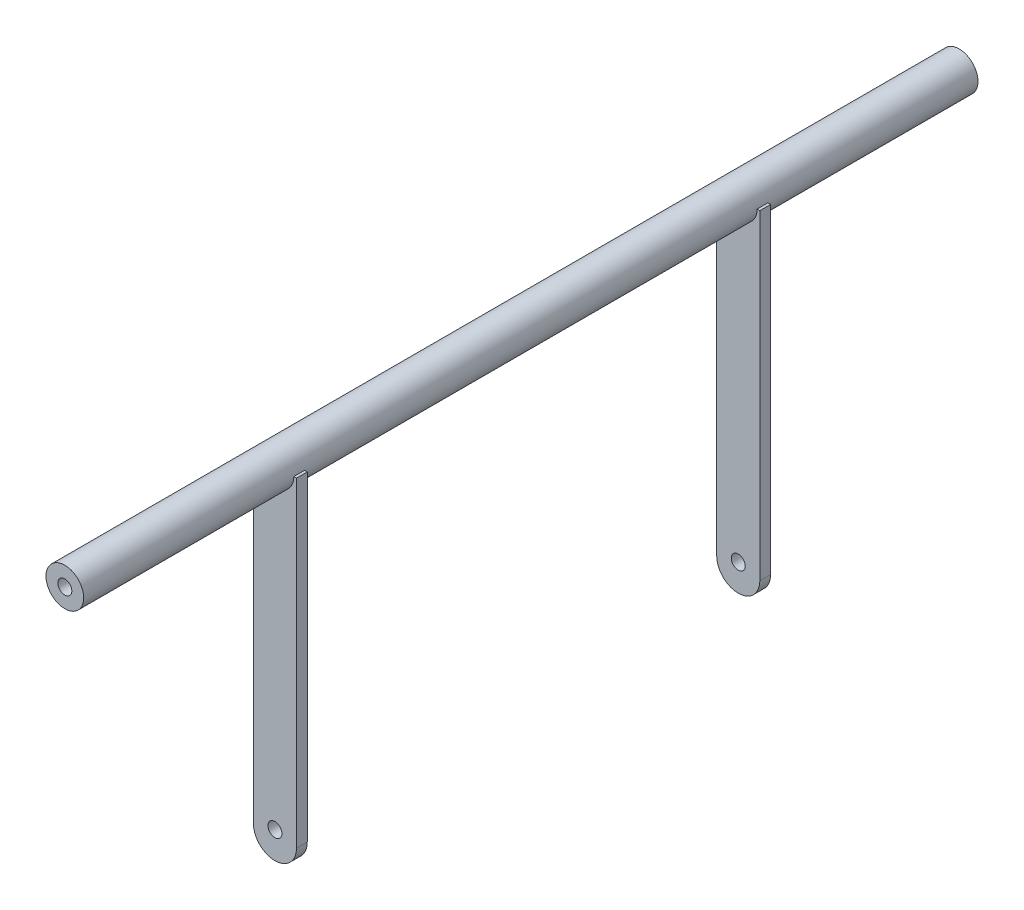
ISO-10303-21;
HEADER;
FILE_DESCRIPTION(('STEP AP214'),'2;1');
FILE_NAME('part.step','',(''),(''),'','','');
FILE_SCHEMA(('AUTOMOTIVE_DESIGN { 1 0 10303 214 1 1 1 1 }'));
ENDSEC;
DATA;
#1=APPLICATION_CONTEXT('core data for automotive mechanical design processes');
#2=APPLICATION_PROTOCOL_DEFINITION('international standard','automotive_design',2000,#1);
#3=PRODUCT_CONTEXT('',#1,'mechanical');
#4=PRODUCT('Part','Part','',(#3));
#5=PRODUCT_RELATED_PRODUCT_CATEGORY('part','',(#4));
#6=PRODUCT_DEFINITION_FORMATION('','',#4);
#7=PRODUCT_DEFINITION_CONTEXT('part definition',#1,'design');
#8=PRODUCT_DEFINITION('design','',#6,#7);
#9=PRODUCT_DEFINITION_SHAPE('','',#8);
#10=(LENGTH_UNIT() NAMED_UNIT(*) SI_UNIT(.MILLI.,.METRE.));
#11=(NAMED_UNIT(*) PLANE_ANGLE_UNIT() SI_UNIT($,.RADIAN.));
#12=(NAMED_UNIT(*) SI_UNIT($,.STERADIAN.) SOLID_ANGLE_UNIT());
#13=UNCERTAINTY_MEASURE_WITH_UNIT(LENGTH_MEASURE(1.E-05),#10,'distance_accuracy_value','');
#14=(GEOMETRIC_REPRESENTATION_CONTEXT(3) GLOBAL_UNCERTAINTY_ASSIGNED_CONTEXT((#13)) GLOBAL_UNIT_ASSIGNED_CONTEXT((#10,
#11,#12)) REPRESENTATION_CONTEXT('',''));
#15=CARTESIAN_POINT('',(0.,0.,0.));
#16=DIRECTION('',(0.,0.,1.));
#17=DIRECTION('',(1.,0.,0.));
#18=AXIS2_PLACEMENT_3D('',#15,#16,#17);
#19=CARTESIAN_POINT('',(0.,0.,415.));
#20=DIRECTION('',(0.,0.,-1.));
#21=DIRECTION('',(-1.,0.,0.));
#22=AXIS2_PLACEMENT_3D('',#19,#20,#21);
#23=CYLINDRICAL_SURFACE('',#22,17.5);
#24=DIRECTION('',(0.,0.,-1.));
#25=VECTOR('',#24,1.);
#26=CARTESIAN_POINT('',(-17.5,0.,415.));
#27=LINE('',#26,#25);
#28=CARTESIAN_POINT('',(-17.5,0.,220.));
#29=VERTEX_POINT('',#28);
#30=CARTESIAN_POINT('',(-17.5,0.,210.));
#31=VERTEX_POINT('',#30);
#32=EDGE_CURVE('E347',#29,#31,#27,.T.);
#33=ORIENTED_EDGE('',*,*,#32,.F.);
#34=CARTESIAN_POINT('',(0.,0.,220.));
#35=DIRECTION('',(0.,0.,-1.));
#36=DIRECTION('',(0.,1.,0.));
#37=AXIS2_PLACEMENT_3D('',#34,#35,#36);
#38=CIRCLE('',#37,17.5);
#39=CARTESIAN_POINT('',(17.5,0.,220.));
#40=VERTEX_POINT('',#39);
#41=EDGE_CURVE('E353',#40,#29,#38,.T.);
#42=ORIENTED_EDGE('',*,*,#41,.F.);
#43=DIRECTION('',(0.,0.,-1.));
#44=VECTOR('',#43,1.);
#45=CARTESIAN_POINT('',(17.5,0.,415.));
#46=LINE('',#45,#44);
#47=CARTESIAN_POINT('',(17.5,0.,210.));
#48=VERTEX_POINT('',#47);
#49=EDGE_CURVE('E343',#48,#40,#46,.F.);
#50=ORIENTED_EDGE('',*,*,#49,.F.);
#51=CARTESIAN_POINT('',(0.,0.,210.));
#52=DIRECTION('',(0.,0.,1.));
#53=DIRECTION('',(0.,-1.,0.));
#54=AXIS2_PLACEMENT_3D('',#51,#52,#53);
#55=CIRCLE('',#54,17.5);
#56=EDGE_CURVE('E350',#31,#48,#55,.T.);
#57=ORIENTED_EDGE('',*,*,#56,.F.);
#58=EDGE_LOOP('',(#33,#42,#50,#57));
#59=FACE_BOUND('',#58,.T.);
#60=CARTESIAN_POINT('',(0.,0.,415.));
#61=DIRECTION('',(0.,0.,1.));
#62=DIRECTION('',(1.,0.,0.));
#63=AXIS2_PLACEMENT_3D('',#60,#61,#62);
#64=CIRCLE('',#63,17.5);
#65=CARTESIAN_POINT('',(17.5,0.,415.));
#66=VERTEX_POINT('',#65);
#67=EDGE_CURVE('E362',#66,#66,#64,.T.);
#68=ORIENTED_EDGE('',*,*,#67,.F.);
#69=EDGE_LOOP('',(#68));
#70=FACE_BOUND('',#69,.T.);
#71=CARTESIAN_POINT('',(0.,0.,-415.));
#72=DIRECTION('',(0.,0.,1.));
#73=DIRECTION('',(1.,0.,0.));
#74=AXIS2_PLACEMENT_3D('',#71,#72,#73);
#75=CIRCLE('',#74,17.5);
#76=CARTESIAN_POINT('',(17.5,0.,-415.));
#77=VERTEX_POINT('',#76);
#78=EDGE_CURVE('E361',#77,#77,#75,.T.);
#79=ORIENTED_EDGE('',*,*,#78,.T.);
#80=EDGE_LOOP('',(#79));
#81=FACE_BOUND('',#80,.T.);
#82=CARTESIAN_POINT('',(0.,0.,-210.));
#83=DIRECTION('',(0.,0.,-1.));
#84=DIRECTION('',(0.,1.,0.));
#85=AXIS2_PLACEMENT_3D('',#82,#83,#84);
#86=CIRCLE('',#85,17.5);
#87=CARTESIAN_POINT('',(17.5,-1.01645684329229E-13,-210.));
#88=VERTEX_POINT('',#87);
#89=CARTESIAN_POINT('',(-17.5,-1.01645684329229E-13,-210.));
#90=VERTEX_POINT('',#89);
#91=EDGE_CURVE('E187',#88,#90,#86,.T.);
#92=ORIENTED_EDGE('',*,*,#91,.F.);
#93=DIRECTION('',(0.,0.,-1.));
#94=VECTOR('',#93,1.);
#95=CARTESIAN_POINT('',(17.5,-1.01645684329229E-13,415.));
#96=LINE('',#95,#94);
#97=CARTESIAN_POINT('',(17.5,0.,-220.));
#98=VERTEX_POINT('',#97);
#99=EDGE_CURVE('E181',#98,#88,#96,.F.);
#100=ORIENTED_EDGE('',*,*,#99,.F.);
#101=CARTESIAN_POINT('',(0.,0.,-220.));
#102=DIRECTION('',(0.,0.,1.));
#103=DIRECTION('',(0.,-1.,0.));
#104=AXIS2_PLACEMENT_3D('',#101,#102,#103);
#105=CIRCLE('',#104,17.5);
#106=CARTESIAN_POINT('',(-17.5,0.,-220.));
#107=VERTEX_POINT('',#106);
#108=EDGE_CURVE('E182',#107,#98,#105,.T.);
#109=ORIENTED_EDGE('',*,*,#108,.F.);
#110=DIRECTION('',(0.,0.,-1.));
#111=VECTOR('',#110,1.);
#112=CARTESIAN_POINT('',(-17.5,-1.01645684329229E-13,415.));
#113=LINE('',#112,#111);
#114=EDGE_CURVE('E324',#90,#107,#113,.T.);
#115=ORIENTED_EDGE('',*,*,#114,.F.);
#116=EDGE_LOOP('',(#92,#100,#109,#115));
#117=FACE_BOUND('',#116,.T.);
#118=ADVANCED_FACE('F33',(#59,#70,#81,#117),#23,.T.);
#119=CARTESIAN_POINT('',(0.,0.,-415.001));
#120=DIRECTION('',(0.,0.,1.));
#121=DIRECTION('',(1.,0.,0.));
#122=AXIS2_PLACEMENT_3D('',#119,#120,#121);
#123=CYLINDRICAL_SURFACE('',#122,6.5);
#124=DIRECTION('',(0.,0.,1.));
#125=VECTOR('',#124,1.);
#126=CARTESIAN_POINT('',(6.5,0.,-415.001));
#127=LINE('',#126,#125);
#128=CARTESIAN_POINT('',(6.5,0.,220.));
#129=VERTEX_POINT('',#128);
#130=CARTESIAN_POINT('',(6.5,0.,210.));
#131=VERTEX_POINT('',#130);
#132=EDGE_CURVE('E376',#129,#131,#127,.F.);
#133=ORIENTED_EDGE('',*,*,#132,.F.);
#134=CARTESIAN_POINT('',(0.,0.,220.));
#135=DIRECTION('',(0.,0.,-1.));
#136=DIRECTION('',(0.,1.,0.));
#137=AXIS2_PLACEMENT_3D('',#134,#135,#136);
#138=CIRCLE('',#137,6.5);
#139=CARTESIAN_POINT('',(-6.5,0.,220.));
#140=VERTEX_POINT('',#139);
#141=EDGE_CURVE('E373',#140,#129,#138,.F.);
#142=ORIENTED_EDGE('',*,*,#141,.F.);
#143=DIRECTION('',(0.,0.,1.));
#144=VECTOR('',#143,1.);
#145=CARTESIAN_POINT('',(-6.5,0.,-415.001));
#146=LINE('',#145,#144);
#147=CARTESIAN_POINT('',(-6.5,0.,210.));
#148=VERTEX_POINT('',#147);
#149=EDGE_CURVE('E365',#148,#140,#146,.T.);
#150=ORIENTED_EDGE('',*,*,#149,.F.);
#151=CARTESIAN_POINT('',(0.,0.,210.));
#152=DIRECTION('',(0.,0.,1.));
#153=DIRECTION('',(0.,-1.,0.));
#154=AXIS2_PLACEMENT_3D('',#151,#152,#153);
#155=CIRCLE('',#154,6.5);
#156=EDGE_CURVE('E370',#131,#148,#155,.F.);
#157=ORIENTED_EDGE('',*,*,#156,.F.);
#158=EDGE_LOOP('',(#133,#142,#150,#157));
#159=FACE_BOUND('',#158,.T.);
#160=CARTESIAN_POINT('',(0.,0.,415.));
#161=DIRECTION('',(0.,0.,1.));
#162=DIRECTION('',(1.,0.,0.));
#163=AXIS2_PLACEMENT_3D('',#160,#161,#162);
#164=CIRCLE('',#163,6.5);
#165=CARTESIAN_POINT('',(6.5,0.,415.));
#166=VERTEX_POINT('',#165);
#167=EDGE_CURVE('E355',#166,#166,#164,.T.);
#168=ORIENTED_EDGE('',*,*,#167,.T.);
#169=EDGE_LOOP('',(#168));
#170=FACE_BOUND('',#169,.T.);
#171=CARTESIAN_POINT('',(0.,0.,-415.));
#172=DIRECTION('',(0.,0.,1.));
#173=DIRECTION('',(1.,0.,0.));
#174=AXIS2_PLACEMENT_3D('',#171,#172,#173);
#175=CIRCLE('',#174,6.5);
#176=CARTESIAN_POINT('',(6.5,0.,-415.));
#177=VERTEX_POINT('',#176);
#178=EDGE_CURVE('E358',#177,#177,#175,.F.);
#179=ORIENTED_EDGE('',*,*,#178,.T.);
#180=EDGE_LOOP('',(#179));
#181=FACE_BOUND('',#180,.T.);
#182=CARTESIAN_POINT('',(0.,0.,-210.));
#183=DIRECTION('',(0.,0.,-1.));
#184=DIRECTION('',(0.,1.,0.));
#185=AXIS2_PLACEMENT_3D('',#182,#183,#184);
#186=CIRCLE('',#185,6.5);
#187=CARTESIAN_POINT('',(-6.5,1.0164592925859E-13,-210.));
#188=VERTEX_POINT('',#187);
#189=CARTESIAN_POINT('',(6.5,1.0164592925859E-13,-210.));
#190=VERTEX_POINT('',#189);
#191=EDGE_CURVE('E388',#188,#190,#186,.F.);
#192=ORIENTED_EDGE('',*,*,#191,.F.);
#193=DIRECTION('',(0.,0.,1.));
#194=VECTOR('',#193,1.);
#195=CARTESIAN_POINT('',(-6.5,1.0164592925859E-13,-415.001));
#196=LINE('',#195,#194);
#197=CARTESIAN_POINT('',(-6.5,0.,-220.));
#198=VERTEX_POINT('',#197);
#199=EDGE_CURVE('E382',#198,#188,#196,.T.);
#200=ORIENTED_EDGE('',*,*,#199,.F.);
#201=CARTESIAN_POINT('',(0.,0.,-220.));
#202=DIRECTION('',(0.,0.,1.));
#203=DIRECTION('',(0.,-1.,0.));
#204=AXIS2_PLACEMENT_3D('',#201,#202,#203);
#205=CIRCLE('',#204,6.5);
#206=CARTESIAN_POINT('',(6.5,0.,-220.));
#207=VERTEX_POINT('',#206);
#208=EDGE_CURVE('E379',#207,#198,#205,.F.);
#209=ORIENTED_EDGE('',*,*,#208,.F.);
#210=DIRECTION('',(0.,0.,1.));
#211=VECTOR('',#210,1.);
#212=CARTESIAN_POINT('',(6.5,1.0164592925859E-13,-415.001));
#213=LINE('',#212,#211);
#214=EDGE_CURVE('E385',#190,#207,#213,.F.);
#215=ORIENTED_EDGE('',*,*,#214,.F.);
#216=EDGE_LOOP('',(#192,#200,#209,#215));
#217=FACE_BOUND('',#216,.T.);
#218=ADVANCED_FACE('F287',(#159,#170,#181,#217),#123,.F.);
#219=CARTESIAN_POINT('',(0.,0.,415.));
#220=DIRECTION('',(0.,0.,1.));
#221=DIRECTION('',(1.,0.,0.));
#222=AXIS2_PLACEMENT_3D('',#219,#220,#221);
#223=PLANE('',#222);
#224=ORIENTED_EDGE('',*,*,#167,.F.);
#225=EDGE_LOOP('',(#224));
#226=FACE_BOUND('',#225,.T.);
#227=ORIENTED_EDGE('',*,*,#67,.T.);
#228=EDGE_LOOP('',(#227));
#229=FACE_BOUND('',#228,.T.);
#230=ADVANCED_FACE('F293',(#226,#229),#223,.T.);
#231=CARTESIAN_POINT('',(0.,0.,-415.));
#232=DIRECTION('',(0.,0.,1.));
#233=DIRECTION('',(1.,0.,0.));
#234=AXIS2_PLACEMENT_3D('',#231,#232,#233);
#235=PLANE('',#234);
#236=ORIENTED_EDGE('',*,*,#178,.F.);
#237=EDGE_LOOP('',(#236));
#238=FACE_BOUND('',#237,.T.);
#239=ORIENTED_EDGE('',*,*,#78,.F.);
#240=EDGE_LOOP('',(#239));
#241=FACE_BOUND('',#240,.T.);
#242=ADVANCED_FACE('F299',(#238,#241),#235,.F.);
#243=CARTESIAN_POINT('',(20.,0.,220.));
#244=DIRECTION('',(0.,-1.,0.));
#245=DIRECTION('',(0.,0.,-1.));
#246=AXIS2_PLACEMENT_3D('',#243,#244,#245);
#247=PLANE('',#246);
#248=DIRECTION('',(-1.,0.,0.));
#249=VECTOR('',#248,1.);
#250=CARTESIAN_POINT('',(20.,0.,220.));
#251=LINE('',#250,#249);
#252=EDGE_CURVE('E339',#129,#140,#251,.T.);
#253=ORIENTED_EDGE('',*,*,#252,.F.);
#254=ORIENTED_EDGE('',*,*,#132,.T.);
#255=DIRECTION('',(-1.,0.,0.));
#256=VECTOR('',#255,1.);
#257=CARTESIAN_POINT('',(20.,0.,210.));
#258=LINE('',#257,#256);
#259=EDGE_CURVE('E344',#131,#148,#258,.T.);
#260=ORIENTED_EDGE('',*,*,#259,.T.);
#261=ORIENTED_EDGE('',*,*,#149,.T.);
#262=EDGE_LOOP('',(#253,#254,#260,#261));
#263=FACE_BOUND('',#262,.T.);
#264=ADVANCED_FACE('F411',(#263),#247,.F.);
#265=CARTESIAN_POINT('',(20.,0.,210.));
#266=DIRECTION('',(0.,0.,1.));
#267=DIRECTION('',(0.,-1.,0.));
#268=AXIS2_PLACEMENT_3D('',#265,#266,#267);
#269=PLANE('',#268);
#270=ORIENTED_EDGE('',*,*,#259,.F.);
#271=ORIENTED_EDGE('',*,*,#156,.T.);
#272=EDGE_LOOP('',(#270,#271));
#273=FACE_BOUND('',#272,.T.);
#274=ADVANCED_FACE('F414',(#273),#269,.F.);
#275=CARTESIAN_POINT('',(20.,0.,220.));
#276=DIRECTION('',(0.,0.,-1.));
#277=DIRECTION('',(0.,1.,0.));
#278=AXIS2_PLACEMENT_3D('',#275,#276,#277);
#279=PLANE('',#278);
#280=ORIENTED_EDGE('',*,*,#252,.T.);
#281=ORIENTED_EDGE('',*,*,#141,.T.);
#282=EDGE_LOOP('',(#280,#281));
#283=FACE_BOUND('',#282,.T.);
#284=ADVANCED_FACE('F416',(#283),#279,.F.);
#285=CARTESIAN_POINT('',(0.,-292.5,220.));
#286=DIRECTION('',(0.,0.,1.));
#287=DIRECTION('',(1.,0.,0.));
#288=AXIS2_PLACEMENT_3D('',#285,#286,#287);
#289=CIRCLE('',#288,6.5);
#290=CARTESIAN_POINT('',(6.5,-292.5,220.));
#291=VERTEX_POINT('',#290);
#292=EDGE_CURVE('E256',#291,#291,#289,.T.);
#293=ORIENTED_EDGE('',*,*,#292,.F.);
#294=EDGE_LOOP('',(#293));
#295=FACE_BOUND('',#294,.T.);
#296=DIRECTION('',(0.,-1.,0.));
#297=VECTOR('',#296,1.);
#298=CARTESIAN_POINT('',(-20.,0.,220.));
#299=LINE('',#298,#297);
#300=CARTESIAN_POINT('',(-20.,0.,220.));
#301=VERTEX_POINT('',#300);
#302=CARTESIAN_POINT('',(-20.,-297.5,220.));
#303=VERTEX_POINT('',#302);
#304=EDGE_CURVE('E317',#301,#303,#299,.T.);
#305=ORIENTED_EDGE('',*,*,#304,.T.);
#306=CARTESIAN_POINT('',(0.,-297.5,220.));
#307=DIRECTION('',(0.,0.,-1.));
#308=DIRECTION('',(0.,1.,0.));
#309=AXIS2_PLACEMENT_3D('',#306,#307,#308);
#310=CIRCLE('',#309,20.);
#311=CARTESIAN_POINT('',(0.,-317.5,220.));
#312=VERTEX_POINT('',#311);
#313=EDGE_CURVE('E42',#303,#312,#310,.F.);
#314=ORIENTED_EDGE('',*,*,#313,.T.);
#315=CARTESIAN_POINT('',(0.,-297.5,220.));
#316=DIRECTION('',(0.,0.,-1.));
#317=DIRECTION('',(0.,1.,0.));
#318=AXIS2_PLACEMENT_3D('',#315,#316,#317);
#319=CIRCLE('',#318,20.);
#320=CARTESIAN_POINT('',(20.,-297.5,220.));
#321=VERTEX_POINT('',#320);
#322=EDGE_CURVE('E50',#312,#321,#319,.F.);
#323=ORIENTED_EDGE('',*,*,#322,.T.);
#324=DIRECTION('',(0.,-1.,0.));
#325=VECTOR('',#324,1.);
#326=CARTESIAN_POINT('',(20.,0.,220.));
#327=LINE('',#326,#325);
#328=CARTESIAN_POINT('',(20.,0.,220.));
#329=VERTEX_POINT('',#328);
#330=EDGE_CURVE('E334',#329,#321,#327,.T.);
#331=ORIENTED_EDGE('',*,*,#330,.F.);
#332=EDGE_CURVE('E335',#329,#40,#251,.T.);
#333=ORIENTED_EDGE('',*,*,#332,.T.);
#334=ORIENTED_EDGE('',*,*,#41,.T.);
#335=EDGE_CURVE('E322',#29,#301,#251,.T.);
#336=ORIENTED_EDGE('',*,*,#335,.T.);
#337=EDGE_LOOP('',(#305,#314,#323,#331,#333,#334,#336));
#338=FACE_BOUND('',#337,.T.);
#339=ADVANCED_FACE('F319',(#295,#338),#279,.F.);
#340=CARTESIAN_POINT('',(0.,-292.5,210.));
#341=DIRECTION('',(0.,0.,1.));
#342=DIRECTION('',(0.,-1.,0.));
#343=AXIS2_PLACEMENT_3D('',#340,#341,#342);
#344=CIRCLE('',#343,6.5);
#345=CARTESIAN_POINT('',(0.,-299.,210.));
#346=VERTEX_POINT('',#345);
#347=EDGE_CURVE('E244',#346,#346,#344,.T.);
#348=ORIENTED_EDGE('',*,*,#347,.T.);
#349=EDGE_LOOP('',(#348));
#350=FACE_BOUND('',#349,.T.);
#351=CARTESIAN_POINT('',(0.,-297.5,210.));
#352=DIRECTION('',(0.,0.,1.));
#353=DIRECTION('',(0.,-1.,0.));
#354=AXIS2_PLACEMENT_3D('',#351,#352,#353);
#355=CIRCLE('',#354,20.);
#356=CARTESIAN_POINT('',(20.,-297.5,210.));
#357=VERTEX_POINT('',#356);
#358=CARTESIAN_POINT('',(0.,-317.5,210.));
#359=VERTEX_POINT('',#358);
#360=EDGE_CURVE('E233',#357,#359,#355,.F.);
#361=ORIENTED_EDGE('',*,*,#360,.T.);
#362=CARTESIAN_POINT('',(0.,-297.5,210.));
#363=DIRECTION('',(0.,0.,1.));
#364=DIRECTION('',(0.,-1.,0.));
#365=AXIS2_PLACEMENT_3D('',#362,#363,#364);
#366=CIRCLE('',#365,20.);
#367=CARTESIAN_POINT('',(-20.,-297.5,210.));
#368=VERTEX_POINT('',#367);
#369=EDGE_CURVE('E235',#359,#368,#366,.F.);
#370=ORIENTED_EDGE('',*,*,#369,.T.);
#371=DIRECTION('',(0.,1.,0.));
#372=VECTOR('',#371,1.);
#373=CARTESIAN_POINT('',(-20.,0.,210.));
#374=LINE('',#373,#372);
#375=CARTESIAN_POINT('',(-20.,0.,210.));
#376=VERTEX_POINT('',#375);
#377=EDGE_CURVE('E318',#368,#376,#374,.T.);
#378=ORIENTED_EDGE('',*,*,#377,.T.);
#379=EDGE_CURVE('E338',#31,#376,#258,.T.);
#380=ORIENTED_EDGE('',*,*,#379,.F.);
#381=ORIENTED_EDGE('',*,*,#56,.T.);
#382=CARTESIAN_POINT('',(20.,0.,210.));
#383=VERTEX_POINT('',#382);
#384=EDGE_CURVE('E340',#383,#48,#258,.T.);
#385=ORIENTED_EDGE('',*,*,#384,.F.);
#386=DIRECTION('',(0.,1.,0.));
#387=VECTOR('',#386,1.);
#388=CARTESIAN_POINT('',(20.,0.,210.));
#389=LINE('',#388,#387);
#390=EDGE_CURVE('E612',#357,#383,#389,.T.);
#391=ORIENTED_EDGE('',*,*,#390,.F.);
#392=EDGE_LOOP('',(#361,#370,#378,#380,#381,#385,#391));
#393=FACE_BOUND('',#392,.T.);
#394=ADVANCED_FACE('F409',(#350,#393),#269,.F.);
#395=ORIENTED_EDGE('',*,*,#335,.F.);
#396=ORIENTED_EDGE('',*,*,#32,.T.);
#397=ORIENTED_EDGE('',*,*,#379,.T.);
#398=DIRECTION('',(0.,0.,1.));
#399=VECTOR('',#398,1.);
#400=CARTESIAN_POINT('',(-20.,0.,220.));
#401=LINE('',#400,#399);
#402=EDGE_CURVE('E326',#376,#301,#401,.T.);
#403=ORIENTED_EDGE('',*,*,#402,.T.);
#404=EDGE_LOOP('',(#395,#396,#397,#403));
#405=FACE_BOUND('',#404,.T.);
#406=ADVANCED_FACE('F406',(#405),#247,.F.);
#407=ORIENTED_EDGE('',*,*,#384,.T.);
#408=ORIENTED_EDGE('',*,*,#49,.T.);
#409=ORIENTED_EDGE('',*,*,#332,.F.);
#410=DIRECTION('',(0.,0.,1.));
#411=VECTOR('',#410,1.);
#412=CARTESIAN_POINT('',(20.,0.,220.));
#413=LINE('',#412,#411);
#414=EDGE_CURVE('E330',#383,#329,#413,.T.);
#415=ORIENTED_EDGE('',*,*,#414,.F.);
#416=EDGE_LOOP('',(#407,#408,#409,#415));
#417=FACE_BOUND('',#416,.T.);
#418=ADVANCED_FACE('F402',(#417),#247,.F.);
#419=CARTESIAN_POINT('',(20.,0.,0.));
#420=DIRECTION('',(1.,0.,0.));
#421=DIRECTION('',(0.,0.,-1.));
#422=AXIS2_PLACEMENT_3D('',#419,#420,#421);
#423=PLANE('',#422);
#424=ORIENTED_EDGE('',*,*,#330,.T.);
#425=DIRECTION('',(0.,0.,-1.));
#426=VECTOR('',#425,1.);
#427=CARTESIAN_POINT('',(20.,-297.5,210.));
#428=LINE('',#427,#426);
#429=EDGE_CURVE('E11',#321,#357,#428,.T.);
#430=ORIENTED_EDGE('',*,*,#429,.T.);
#431=ORIENTED_EDGE('',*,*,#390,.T.);
#432=ORIENTED_EDGE('',*,*,#414,.T.);
#433=EDGE_LOOP('',(#424,#430,#431,#432));
#434=FACE_BOUND('',#433,.T.);
#435=ADVANCED_FACE('F399',(#434),#423,.T.);
#436=CARTESIAN_POINT('',(-20.,0.,0.));
#437=DIRECTION('',(1.,0.,0.));
#438=DIRECTION('',(0.,0.,-1.));
#439=AXIS2_PLACEMENT_3D('',#436,#437,#438);
#440=PLANE('',#439);
#441=ORIENTED_EDGE('',*,*,#377,.F.);
#442=DIRECTION('',(0.,0.,-1.));
#443=VECTOR('',#442,1.);
#444=CARTESIAN_POINT('',(-20.,-297.5,0.));
#445=LINE('',#444,#443);
#446=EDGE_CURVE('E237',#368,#303,#445,.F.);
#447=ORIENTED_EDGE('',*,*,#446,.T.);
#448=ORIENTED_EDGE('',*,*,#304,.F.);
#449=ORIENTED_EDGE('',*,*,#402,.F.);
#450=EDGE_LOOP('',(#441,#447,#448,#449));
#451=FACE_BOUND('',#450,.T.);
#452=ADVANCED_FACE('F315',(#451),#440,.F.);
#453=CARTESIAN_POINT('',(20.,0.,-220.));
#454=DIRECTION('',(0.,0.,1.));
#455=DIRECTION('',(0.,-1.,0.));
#456=AXIS2_PLACEMENT_3D('',#453,#454,#455);
#457=PLANE('',#456);
#458=DIRECTION('',(-1.,0.,0.));
#459=VECTOR('',#458,1.);
#460=CARTESIAN_POINT('',(20.,0.,-220.));
#461=LINE('',#460,#459);
#462=EDGE_CURVE('E194',#207,#198,#461,.T.);
#463=ORIENTED_EDGE('',*,*,#462,.F.);
#464=ORIENTED_EDGE('',*,*,#208,.T.);
#465=EDGE_LOOP('',(#463,#464));
#466=FACE_BOUND('',#465,.T.);
#467=ADVANCED_FACE('F280',(#466),#457,.F.);
#468=CARTESIAN_POINT('',(20.,0.,-210.));
#469=DIRECTION('',(0.,0.,-1.));
#470=DIRECTION('',(0.,1.,0.));
#471=AXIS2_PLACEMENT_3D('',#468,#469,#470);
#472=PLANE('',#471);
#473=DIRECTION('',(-1.,0.,0.));
#474=VECTOR('',#473,1.);
#475=CARTESIAN_POINT('',(20.,0.,-210.));
#476=LINE('',#475,#474);
#477=EDGE_CURVE('E183',#190,#188,#476,.T.);
#478=ORIENTED_EDGE('',*,*,#477,.T.);
#479=ORIENTED_EDGE('',*,*,#191,.T.);
#480=EDGE_LOOP('',(#478,#479));
#481=FACE_BOUND('',#480,.T.);
#482=ADVANCED_FACE('F274',(#481),#472,.F.);
#483=CARTESIAN_POINT('',(20.,0.,-220.));
#484=DIRECTION('',(0.,-1.,0.));
#485=DIRECTION('',(0.,0.,-1.));
#486=AXIS2_PLACEMENT_3D('',#483,#484,#485);
#487=PLANE('',#486);
#488=ORIENTED_EDGE('',*,*,#477,.F.);
#489=ORIENTED_EDGE('',*,*,#214,.T.);
#490=ORIENTED_EDGE('',*,*,#462,.T.);
#491=ORIENTED_EDGE('',*,*,#199,.T.);
#492=EDGE_LOOP('',(#488,#489,#490,#491));
#493=FACE_BOUND('',#492,.T.);
#494=ADVANCED_FACE('F283',(#493),#487,.F.);
#495=CARTESIAN_POINT('',(-20.,0.,-210.));
#496=VERTEX_POINT('',#495);
#497=EDGE_CURVE('E185',#90,#496,#476,.T.);
#498=ORIENTED_EDGE('',*,*,#497,.F.);
#499=ORIENTED_EDGE('',*,*,#114,.T.);
#500=CARTESIAN_POINT('',(-20.,0.,-220.));
#501=VERTEX_POINT('',#500);
#502=EDGE_CURVE('E195',#107,#501,#461,.T.);
#503=ORIENTED_EDGE('',*,*,#502,.T.);
#504=DIRECTION('',(0.,0.,1.));
#505=VECTOR('',#504,1.);
#506=CARTESIAN_POINT('',(-20.,0.,-220.));
#507=LINE('',#506,#505);
#508=EDGE_CURVE('E206',#501,#496,#507,.T.);
#509=ORIENTED_EDGE('',*,*,#508,.T.);
#510=EDGE_LOOP('',(#498,#499,#503,#509));
#511=FACE_BOUND('',#510,.T.);
#512=ADVANCED_FACE('F281',(#511),#487,.F.);
#513=CARTESIAN_POINT('',(20.,0.,-220.));
#514=VERTEX_POINT('',#513);
#515=EDGE_CURVE('E191',#514,#98,#461,.T.);
#516=ORIENTED_EDGE('',*,*,#515,.T.);
#517=ORIENTED_EDGE('',*,*,#99,.T.);
#518=CARTESIAN_POINT('',(20.,0.,-210.));
#519=VERTEX_POINT('',#518);
#520=EDGE_CURVE('E163',#519,#88,#476,.T.);
#521=ORIENTED_EDGE('',*,*,#520,.F.);
#522=DIRECTION('',(0.,0.,1.));
#523=VECTOR('',#522,1.);
#524=CARTESIAN_POINT('',(20.,0.,-220.));
#525=LINE('',#524,#523);
#526=EDGE_CURVE('E169',#514,#519,#525,.T.);
#527=ORIENTED_EDGE('',*,*,#526,.F.);
#528=EDGE_LOOP('',(#516,#517,#521,#527));
#529=FACE_BOUND('',#528,.T.);
#530=ADVANCED_FACE('F180',(#529),#487,.F.);
#531=CARTESIAN_POINT('',(0.,-292.5,-210.));
#532=DIRECTION('',(0.,0.,-1.));
#533=DIRECTION('',(0.,1.,0.));
#534=AXIS2_PLACEMENT_3D('',#531,#532,#533);
#535=CIRCLE('',#534,6.5);
#536=CARTESIAN_POINT('',(0.,-286.,-210.));
#537=VERTEX_POINT('',#536);
#538=EDGE_CURVE('E249',#537,#537,#535,.T.);
#539=ORIENTED_EDGE('',*,*,#538,.T.);
#540=EDGE_LOOP('',(#539));
#541=FACE_BOUND('',#540,.T.);
#542=DIRECTION('',(0.,-1.,0.));
#543=VECTOR('',#542,1.);
#544=CARTESIAN_POINT('',(-20.,0.,-210.));
#545=LINE('',#544,#543);
#546=CARTESIAN_POINT('',(-20.,-297.5,-210.));
#547=VERTEX_POINT('',#546);
#548=EDGE_CURVE('E208',#496,#547,#545,.T.);
#549=ORIENTED_EDGE('',*,*,#548,.T.);
#550=CARTESIAN_POINT('',(0.,-297.5,-210.));
#551=DIRECTION('',(0.,0.,-1.));
#552=DIRECTION('',(0.,1.,0.));
#553=AXIS2_PLACEMENT_3D('',#550,#551,#552);
#554=CIRCLE('',#553,20.);
#555=CARTESIAN_POINT('',(0.,-317.5,-210.));
#556=VERTEX_POINT('',#555);
#557=EDGE_CURVE('E223',#547,#556,#554,.F.);
#558=ORIENTED_EDGE('',*,*,#557,.T.);
#559=CARTESIAN_POINT('',(0.,-297.5,-210.));
#560=DIRECTION('',(0.,0.,-1.));
#561=DIRECTION('',(0.,1.,0.));
#562=AXIS2_PLACEMENT_3D('',#559,#560,#561);
#563=CIRCLE('',#562,20.);
#564=CARTESIAN_POINT('',(20.,-297.5,-210.));
#565=VERTEX_POINT('',#564);
#566=EDGE_CURVE('E165',#556,#565,#563,.F.);
#567=ORIENTED_EDGE('',*,*,#566,.T.);
#568=DIRECTION('',(0.,-1.,0.));
#569=VECTOR('',#568,1.);
#570=CARTESIAN_POINT('',(20.,0.,-210.));
#571=LINE('',#570,#569);
#572=EDGE_CURVE('E157',#519,#565,#571,.T.);
#573=ORIENTED_EDGE('',*,*,#572,.F.);
#574=ORIENTED_EDGE('',*,*,#520,.T.);
#575=ORIENTED_EDGE('',*,*,#91,.T.);
#576=ORIENTED_EDGE('',*,*,#497,.T.);
#577=EDGE_LOOP('',(#549,#558,#567,#573,#574,#575,#576));
#578=FACE_BOUND('',#577,.T.);
#579=ADVANCED_FACE('F160',(#541,#578),#472,.F.);
#580=CARTESIAN_POINT('',(0.,-292.5,-220.));
#581=DIRECTION('',(0.,0.,1.));
#582=DIRECTION('',(0.,-1.,0.));
#583=AXIS2_PLACEMENT_3D('',#580,#581,#582);
#584=CIRCLE('',#583,6.5);
#585=CARTESIAN_POINT('',(0.,-299.,-220.));
#586=VERTEX_POINT('',#585);
#587=EDGE_CURVE('E37',#586,#586,#584,.T.);
#588=ORIENTED_EDGE('',*,*,#587,.T.);
#589=EDGE_LOOP('',(#588));
#590=FACE_BOUND('',#589,.T.);
#591=CARTESIAN_POINT('',(0.,-297.5,-220.));
#592=DIRECTION('',(0.,0.,1.));
#593=DIRECTION('',(0.,-1.,0.));
#594=AXIS2_PLACEMENT_3D('',#591,#592,#593);
#595=CIRCLE('',#594,20.);
#596=CARTESIAN_POINT('',(20.,-297.5,-220.));
#597=VERTEX_POINT('',#596);
#598=CARTESIAN_POINT('',(0.,-317.5,-220.));
#599=VERTEX_POINT('',#598);
#600=EDGE_CURVE('E226',#597,#599,#595,.F.);
#601=ORIENTED_EDGE('',*,*,#600,.T.);
#602=CARTESIAN_POINT('',(0.,-297.5,-220.));
#603=DIRECTION('',(0.,0.,1.));
#604=DIRECTION('',(0.,-1.,0.));
#605=AXIS2_PLACEMENT_3D('',#602,#603,#604);
#606=CIRCLE('',#605,20.);
#607=CARTESIAN_POINT('',(-20.,-297.5,-220.));
#608=VERTEX_POINT('',#607);
#609=EDGE_CURVE('E214',#599,#608,#606,.F.);
#610=ORIENTED_EDGE('',*,*,#609,.T.);
#611=DIRECTION('',(0.,1.,0.));
#612=VECTOR('',#611,1.);
#613=CARTESIAN_POINT('',(-20.,0.,-220.));
#614=LINE('',#613,#612);
#615=EDGE_CURVE('E177',#608,#501,#614,.T.);
#616=ORIENTED_EDGE('',*,*,#615,.T.);
#617=ORIENTED_EDGE('',*,*,#502,.F.);
#618=ORIENTED_EDGE('',*,*,#108,.T.);
#619=ORIENTED_EDGE('',*,*,#515,.F.);
#620=DIRECTION('',(0.,1.,0.));
#621=VECTOR('',#620,1.);
#622=CARTESIAN_POINT('',(20.,0.,-220.));
#623=LINE('',#622,#621);
#624=EDGE_CURVE('E168',#597,#514,#623,.T.);
#625=ORIENTED_EDGE('',*,*,#624,.F.);
#626=EDGE_LOOP('',(#601,#610,#616,#617,#618,#619,#625));
#627=FACE_BOUND('',#626,.T.);
#628=ADVANCED_FACE('F212',(#590,#627),#457,.F.);
#629=CARTESIAN_POINT('',(20.,0.,0.));
#630=DIRECTION('',(1.,0.,0.));
#631=DIRECTION('',(0.,0.,-1.));
#632=AXIS2_PLACEMENT_3D('',#629,#630,#631);
#633=PLANE('',#632);
#634=ORIENTED_EDGE('',*,*,#572,.T.);
#635=DIRECTION('',(0.,0.,-1.));
#636=VECTOR('',#635,1.);
#637=CARTESIAN_POINT('',(20.,-297.5,-220.));
#638=LINE('',#637,#636);
#639=EDGE_CURVE('E231',#565,#597,#638,.T.);
#640=ORIENTED_EDGE('',*,*,#639,.T.);
#641=ORIENTED_EDGE('',*,*,#624,.T.);
#642=ORIENTED_EDGE('',*,*,#526,.T.);
#643=EDGE_LOOP('',(#634,#640,#641,#642));
#644=FACE_BOUND('',#643,.T.);
#645=ADVANCED_FACE('F172',(#644),#633,.T.);
#646=CARTESIAN_POINT('',(-20.,0.,0.));
#647=DIRECTION('',(1.,0.,0.));
#648=DIRECTION('',(0.,0.,-1.));
#649=AXIS2_PLACEMENT_3D('',#646,#647,#648);
#650=PLANE('',#649);
#651=ORIENTED_EDGE('',*,*,#615,.F.);
#652=DIRECTION('',(0.,0.,-1.));
#653=VECTOR('',#652,1.);
#654=CARTESIAN_POINT('',(-20.,-297.5,0.));
#655=LINE('',#654,#653);
#656=EDGE_CURVE('E219',#608,#547,#655,.F.);
#657=ORIENTED_EDGE('',*,*,#656,.T.);
#658=ORIENTED_EDGE('',*,*,#548,.F.);
#659=ORIENTED_EDGE('',*,*,#508,.F.);
#660=EDGE_LOOP('',(#651,#657,#658,#659));
#661=FACE_BOUND('',#660,.T.);
#662=ADVANCED_FACE('F218',(#661),#650,.F.);
#663=CARTESIAN_POINT('',(0.,-297.5,0.));
#664=DIRECTION('',(0.,0.,1.));
#665=DIRECTION('',(1.,0.,0.));
#666=AXIS2_PLACEMENT_3D('',#663,#664,#665);
#667=CYLINDRICAL_SURFACE('',#666,20.);
#668=ORIENTED_EDGE('',*,*,#639,.F.);
#669=ORIENTED_EDGE('',*,*,#566,.F.);
#670=DIRECTION('',(0.,0.,-1.));
#671=VECTOR('',#670,1.);
#672=CARTESIAN_POINT('',(0.,-317.5,-210.));
#673=LINE('',#672,#671);
#674=EDGE_CURVE('E209',#599,#556,#673,.F.);
#675=ORIENTED_EDGE('',*,*,#674,.F.);
#676=ORIENTED_EDGE('',*,*,#600,.F.);
#677=EDGE_LOOP('',(#668,#669,#675,#676));
#678=FACE_BOUND('',#677,.T.);
#679=ADVANCED_FACE('F303',(#678),#667,.T.);
#680=CARTESIAN_POINT('',(0.,-297.5,-220.));
#681=DIRECTION('',(0.,0.,-1.));
#682=DIRECTION('',(-1.,0.,0.));
#683=AXIS2_PLACEMENT_3D('',#680,#681,#682);
#684=CYLINDRICAL_SURFACE('',#683,20.);
#685=ORIENTED_EDGE('',*,*,#557,.F.);
#686=ORIENTED_EDGE('',*,*,#656,.F.);
#687=ORIENTED_EDGE('',*,*,#609,.F.);
#688=ORIENTED_EDGE('',*,*,#674,.T.);
#689=EDGE_LOOP('',(#685,#686,#687,#688));
#690=FACE_BOUND('',#689,.T.);
#691=ADVANCED_FACE('F221',(#690),#684,.T.);
#692=CARTESIAN_POINT('',(0.,-297.5,0.));
#693=DIRECTION('',(0.,0.,1.));
#694=DIRECTION('',(1.,0.,0.));
#695=AXIS2_PLACEMENT_3D('',#692,#693,#694);
#696=CYLINDRICAL_SURFACE('',#695,20.);
#697=ORIENTED_EDGE('',*,*,#429,.F.);
#698=ORIENTED_EDGE('',*,*,#322,.F.);
#699=DIRECTION('',(0.,0.,-1.));
#700=VECTOR('',#699,1.);
#701=CARTESIAN_POINT('',(0.,-317.5,220.));
#702=LINE('',#701,#700);
#703=EDGE_CURVE('E242',#359,#312,#702,.F.);
#704=ORIENTED_EDGE('',*,*,#703,.F.);
#705=ORIENTED_EDGE('',*,*,#360,.F.);
#706=EDGE_LOOP('',(#697,#698,#704,#705));
#707=FACE_BOUND('',#706,.T.);
#708=ADVANCED_FACE('F35',(#707),#696,.T.);
#709=CARTESIAN_POINT('',(0.,-297.5,220.));
#710=DIRECTION('',(0.,0.,-1.));
#711=DIRECTION('',(-1.,0.,0.));
#712=AXIS2_PLACEMENT_3D('',#709,#710,#711);
#713=CYLINDRICAL_SURFACE('',#712,20.);
#714=ORIENTED_EDGE('',*,*,#313,.F.);
#715=ORIENTED_EDGE('',*,*,#446,.F.);
#716=ORIENTED_EDGE('',*,*,#369,.F.);
#717=ORIENTED_EDGE('',*,*,#703,.T.);
#718=EDGE_LOOP('',(#714,#715,#716,#717));
#719=FACE_BOUND('',#718,.T.);
#720=ADVANCED_FACE('F268',(#719),#713,.T.);
#721=CARTESIAN_POINT('',(0.,-292.5,-322.));
#722=DIRECTION('',(0.,0.,1.));
#723=DIRECTION('',(1.,0.,0.));
#724=AXIS2_PLACEMENT_3D('',#721,#722,#723);
#725=CYLINDRICAL_SURFACE('',#724,6.5);
#726=ORIENTED_EDGE('',*,*,#587,.F.);
#727=EDGE_LOOP('',(#726));
#728=FACE_BOUND('',#727,.T.);
#729=ORIENTED_EDGE('',*,*,#538,.F.);
#730=EDGE_LOOP('',(#729));
#731=FACE_BOUND('',#730,.T.);
#732=ADVANCED_FACE('F264',(#728,#731),#725,.F.);
#733=ORIENTED_EDGE('',*,*,#292,.T.);
#734=EDGE_LOOP('',(#733));
#735=FACE_BOUND('',#734,.T.);
#736=ORIENTED_EDGE('',*,*,#347,.F.);
#737=EDGE_LOOP('',(#736));
#738=FACE_BOUND('',#737,.T.);
#739=ADVANCED_FACE('F267',(#735,#738),#725,.F.);
#740=CLOSED_SHELL('',(#118,#218,#230,#242,#264,#274,#284,#339,#394,#406,#418,#435,#452,#467,
#482,#494,#512,#530,#579,#628,#645,#662,#679,#691,#708,#720,#732,#739));
#741=MANIFOLD_SOLID_BREP('B2',#740);
#742=ADVANCED_BREP_SHAPE_REPRESENTATION('',(#18,#741),#14);
#743=SHAPE_DEFINITION_REPRESENTATION(#9,#742);
ENDSEC;
END-ISO-10303-21;
